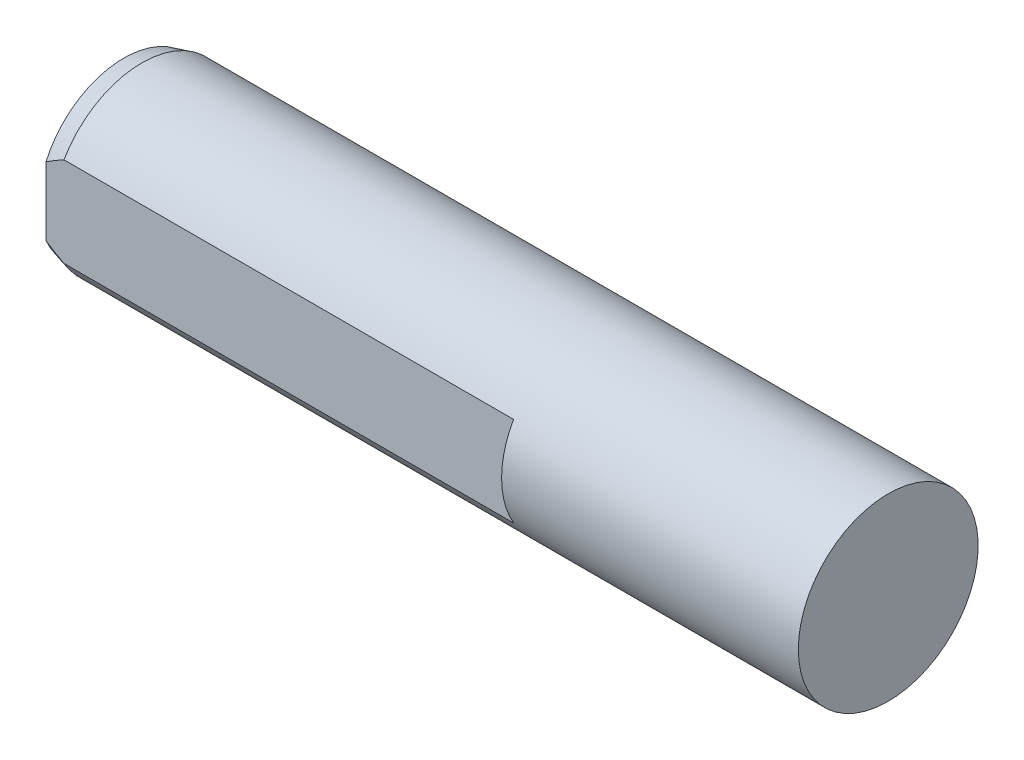
ISO-10303-21;
HEADER;
FILE_DESCRIPTION(('STEP AP214'),'2;1');
FILE_NAME('part.step','',(''),(''),'','','');
FILE_SCHEMA(('AUTOMOTIVE_DESIGN { 1 0 10303 214 1 1 1 1 }'));
ENDSEC;
DATA;
#1=APPLICATION_CONTEXT('core data for automotive mechanical design processes');
#2=APPLICATION_PROTOCOL_DEFINITION('international standard','automotive_design',2000,#1);
#3=PRODUCT_CONTEXT('',#1,'mechanical');
#4=PRODUCT('Part','Part','',(#3));
#5=PRODUCT_RELATED_PRODUCT_CATEGORY('part','',(#4));
#6=PRODUCT_DEFINITION_FORMATION('','',#4);
#7=PRODUCT_DEFINITION_CONTEXT('part definition',#1,'design');
#8=PRODUCT_DEFINITION('design','',#6,#7);
#9=PRODUCT_DEFINITION_SHAPE('','',#8);
#10=(LENGTH_UNIT() NAMED_UNIT(*) SI_UNIT(.MILLI.,.METRE.));
#11=(NAMED_UNIT(*) PLANE_ANGLE_UNIT() SI_UNIT($,.RADIAN.));
#12=(NAMED_UNIT(*) SI_UNIT($,.STERADIAN.) SOLID_ANGLE_UNIT());
#13=UNCERTAINTY_MEASURE_WITH_UNIT(LENGTH_MEASURE(1.E-05),#10,'distance_accuracy_value','');
#14=(GEOMETRIC_REPRESENTATION_CONTEXT(3) GLOBAL_UNCERTAINTY_ASSIGNED_CONTEXT((#13)) GLOBAL_UNIT_ASSIGNED_CONTEXT((#10,
#11,#12)) REPRESENTATION_CONTEXT('',''));
#15=CARTESIAN_POINT('',(0.,0.,0.));
#16=DIRECTION('',(0.,0.,1.));
#17=DIRECTION('',(1.,0.,0.));
#18=AXIS2_PLACEMENT_3D('',#15,#16,#17);
#19=CARTESIAN_POINT('',(-11.75,0.,0.));
#20=DIRECTION('',(-1.,0.,0.));
#21=DIRECTION('',(0.,0.,1.));
#22=AXIS2_PLACEMENT_3D('',#19,#20,#21);
#23=PLANE('',#22);
#24=DIRECTION('',(0.,1.,0.));
#25=VECTOR('',#24,1.);
#26=CARTESIAN_POINT('',(-11.75,0.,1.3));
#27=LINE('',#26,#25);
#28=CARTESIAN_POINT('',(-11.7500000000632,0.570357288169134,1.29999999999921));
#29=VERTEX_POINT('',#28);
#30=CARTESIAN_POINT('',(-11.7500000000316,-0.570357288188414,1.3));
#31=VERTEX_POINT('',#30);
#32=EDGE_CURVE('E64',#29,#31,#27,.F.);
#33=ORIENTED_EDGE('',*,*,#32,.F.);
#34=CARTESIAN_POINT('',(-11.7500000000632,0.,0.));
#35=DIRECTION('',(1.,0.,0.));
#36=DIRECTION('',(0.,0.,-1.));
#37=AXIS2_PLACEMENT_3D('',#34,#35,#36);
#38=CIRCLE('',#37,1.41961524229828);
#39=EDGE_CURVE('E20',#31,#29,#38,.T.);
#40=ORIENTED_EDGE('',*,*,#39,.F.);
#41=EDGE_LOOP('',(#33,#40));
#42=FACE_BOUND('',#41,.T.);
#43=ADVANCED_FACE('F17',(#42),#23,.T.);
#44=CARTESIAN_POINT('',(1.,0.,0.));
#45=DIRECTION('',(1.,0.,0.));
#46=DIRECTION('',(0.,0.,-1.));
#47=AXIS2_PLACEMENT_3D('',#44,#45,#46);
#48=PLANE('',#47);
#49=CARTESIAN_POINT('',(1.,0.,0.));
#50=DIRECTION('',(-1.,0.,0.));
#51=DIRECTION('',(0.,0.,1.));
#52=AXIS2_PLACEMENT_3D('',#49,#50,#51);
#53=CIRCLE('',#52,1.5);
#54=CARTESIAN_POINT('',(1.,0.,1.5));
#55=VERTEX_POINT('',#54);
#56=EDGE_CURVE('E106',#55,#55,#53,.T.);
#57=ORIENTED_EDGE('',*,*,#56,.F.);
#58=EDGE_LOOP('',(#57));
#59=FACE_BOUND('',#58,.T.);
#60=ADVANCED_FACE('F91',(#59),#48,.T.);
#61=CARTESIAN_POINT('',(-3.95,0.,1.4));
#62=DIRECTION('',(-1.,0.,0.));
#63=DIRECTION('',(0.,0.,1.));
#64=AXIS2_PLACEMENT_3D('',#61,#62,#63);
#65=PLANE('',#64);
#66=DIRECTION('',(0.,1.,0.));
#67=VECTOR('',#66,1.);
#68=CARTESIAN_POINT('',(-3.95,0.,1.3));
#69=LINE('',#68,#67);
#70=CARTESIAN_POINT('',(-3.95,-0.748331477354788,1.3));
#71=VERTEX_POINT('',#70);
#72=CARTESIAN_POINT('',(-3.95,0.748331477354789,1.3));
#73=VERTEX_POINT('',#72);
#74=EDGE_CURVE('E63',#71,#73,#69,.T.);
#75=ORIENTED_EDGE('',*,*,#74,.F.);
#76=CARTESIAN_POINT('',(-3.95,0.,0.));
#77=DIRECTION('',(-1.,0.,0.));
#78=DIRECTION('',(0.,0.,1.));
#79=AXIS2_PLACEMENT_3D('',#76,#77,#78);
#80=CIRCLE('',#79,1.5);
#81=EDGE_CURVE('E71',#73,#71,#80,.F.);
#82=ORIENTED_EDGE('',*,*,#81,.F.);
#83=EDGE_LOOP('',(#75,#82));
#84=FACE_BOUND('',#83,.T.);
#85=ADVANCED_FACE('F89',(#84),#65,.T.);
#86=CARTESIAN_POINT('',(-7.85,0.,1.3));
#87=DIRECTION('',(0.,0.,1.));
#88=DIRECTION('',(1.,0.,0.));
#89=AXIS2_PLACEMENT_3D('',#86,#87,#88);
#90=PLANE('',#89);
#91=DIRECTION('',(-1.,0.,0.));
#92=VECTOR('',#91,1.);
#93=CARTESIAN_POINT('',(-5.375,-0.748331477354789,1.3));
#94=LINE('',#93,#92);
#95=CARTESIAN_POINT('',(-11.449999999984,-0.74833147736012,1.30000000000926));
#96=VERTEX_POINT('',#95);
#97=EDGE_CURVE('E26',#71,#96,#94,.T.);
#98=ORIENTED_EDGE('',*,*,#97,.F.);
#99=ORIENTED_EDGE('',*,*,#74,.T.);
#100=DIRECTION('',(1.,0.,0.));
#101=VECTOR('',#100,1.);
#102=CARTESIAN_POINT('',(-7.85,0.748331477354789,1.3));
#103=LINE('',#102,#101);
#104=CARTESIAN_POINT('',(-11.449999999984,0.74833147736012,1.30000000000926));
#105=VERTEX_POINT('',#104);
#106=EDGE_CURVE('E56',#73,#105,#103,.F.);
#107=ORIENTED_EDGE('',*,*,#106,.T.);
#108=CARTESIAN_POINT('',(-11.7500000000632,0.570357288170932,1.29999999999842));
#109=CARTESIAN_POINT('',(-11.7388989444002,0.577760453697229,1.29999999100648));
#110=CARTESIAN_POINT('',(-11.7277427215158,0.585080483192389,1.29999992240212));
#111=CARTESIAN_POINT('',(-11.7050482896739,0.59974733404972,1.29999973747594));
#112=CARTESIAN_POINT('',(-11.693507526915,0.60709020565359,1.29999961999826));
#113=CARTESIAN_POINT('',(-11.6700441536913,0.621804809105704,1.29999941429875));
#114=CARTESIAN_POINT('',(-11.6581191672071,0.62917274797282,1.29999932687393));
#115=CARTESIAN_POINT('',(-11.6338870915622,0.643939183072896,1.29999921269528));
#116=CARTESIAN_POINT('',(-11.6215777818672,0.651334033210612,1.29999918747488));
#117=CARTESIAN_POINT('',(-11.5965769335581,0.666156018057409,1.29999920450629));
#118=CARTESIAN_POINT('',(-11.5838833214961,0.673579652901559,1.29999924839522));
#119=CARTESIAN_POINT('',(-11.558113705059,0.688460833274241,1.29999938495844));
#120=CARTESIAN_POINT('',(-11.5450357624759,0.695915020520075,1.29999947876316));
#121=CARTESIAN_POINT('',(-11.5184974065824,0.710858948931249,1.29999967657035));
#122=CARTESIAN_POINT('',(-11.5050351820795,0.71834547102474,1.2999997807595));
#123=CARTESIAN_POINT('',(-11.4777279369921,0.733355386280835,1.29999994259857));
#124=CARTESIAN_POINT('',(-11.4638812169596,0.74087568881687,1.29999999912658));
#125=CARTESIAN_POINT('',(-11.449999999968,0.748331477365451,1.30000000001852));
#126=B_SPLINE_CURVE_WITH_KNOTS('',3,(#108,#109,#110,#111,#112,#113,#114,#115,#116,#117,#118,
#119,#120,#121,#122,#123,#124,#125),.UNSPECIFIED.,.F.,.F.,(4,2,2,2,2,2,2,2,4),(0.,
0.0400288174334433,0.0810635960815221,0.123115125839812,0.166193366976947,0.210307521132346,
0.255466095813731,0.301676962959842,0.348947412102482),.UNSPECIFIED.);
#127=EDGE_CURVE('E58',#29,#105,#126,.T.);
#128=ORIENTED_EDGE('',*,*,#127,.F.);
#129=ORIENTED_EDGE('',*,*,#32,.T.);
#130=CARTESIAN_POINT('',(-11.449999999968,-0.748331477365451,1.30000000001852));
#131=CARTESIAN_POINT('',(-11.4638812169596,-0.740875688816869,1.29999999912658));
#132=CARTESIAN_POINT('',(-11.4777279369921,-0.733355386280835,1.29999994259857));
#133=CARTESIAN_POINT('',(-11.5050351820795,-0.71834547102474,1.2999997807595));
#134=CARTESIAN_POINT('',(-11.5184974065824,-0.710858948931249,1.29999967657035));
#135=CARTESIAN_POINT('',(-11.5450357624759,-0.695915020520074,1.29999947876316));
#136=CARTESIAN_POINT('',(-11.558113705059,-0.68846083327424,1.29999938495844));
#137=CARTESIAN_POINT('',(-11.5838833214961,-0.673579652901559,1.29999924839522));
#138=CARTESIAN_POINT('',(-11.5965769335581,-0.666156018057409,1.29999920450629));
#139=CARTESIAN_POINT('',(-11.6215777818672,-0.651334033210612,1.29999918747488));
#140=CARTESIAN_POINT('',(-11.6338870915622,-0.643939183072895,1.29999921269528));
#141=CARTESIAN_POINT('',(-11.6581191672071,-0.629172747972819,1.29999932687393));
#142=CARTESIAN_POINT('',(-11.6700441536913,-0.621804809105704,1.29999941429875));
#143=CARTESIAN_POINT('',(-11.693507526915,-0.60709020565359,1.29999961999826));
#144=CARTESIAN_POINT('',(-11.7050482896739,-0.59974733404972,1.29999973747594));
#145=CARTESIAN_POINT('',(-11.7277427215158,-0.585080483192387,1.29999992240212));
#146=CARTESIAN_POINT('',(-11.7388989444002,-0.577760453697227,1.29999999100648));
#147=CARTESIAN_POINT('',(-11.7500000000632,-0.570357288170932,1.29999999999842));
#148=B_SPLINE_CURVE_WITH_KNOTS('',3,(#130,#131,#132,#133,#134,#135,#136,#137,#138,#139,#140,
#141,#142,#143,#144,#145,#146,#147),.UNSPECIFIED.,.F.,.F.,(4,2,2,2,2,2,2,2,4),(0.,
0.0472704491426399,0.0934813162887527,0.138639890970136,0.182754045125537,0.22583228626267,
0.267883816020961,0.308918594669039,0.348947412102482),.UNSPECIFIED.);
#149=EDGE_CURVE('E35',#96,#31,#148,.T.);
#150=ORIENTED_EDGE('',*,*,#149,.F.);
#151=EDGE_LOOP('',(#98,#99,#107,#128,#129,#150));
#152=FACE_BOUND('',#151,.T.);
#153=ADVANCED_FACE('F62',(#152),#90,.T.);
#154=CARTESIAN_POINT('',(-11.449999999968,0.,0.));
#155=DIRECTION('',(1.,0.,0.));
#156=DIRECTION('',(0.,0.,-1.));
#157=AXIS2_PLACEMENT_3D('',#154,#155,#156);
#158=CONICAL_SURFACE('',#157,1.50000000002137,0.261799387700385);
#159=ORIENTED_EDGE('',*,*,#149,.T.);
#160=ORIENTED_EDGE('',*,*,#39,.T.);
#161=ORIENTED_EDGE('',*,*,#127,.T.);
#162=CARTESIAN_POINT('',(-11.45,0.,0.));
#163=DIRECTION('',(-1.,0.,0.));
#164=DIRECTION('',(0.,0.,1.));
#165=AXIS2_PLACEMENT_3D('',#162,#163,#164);
#166=CIRCLE('',#165,1.5);
#167=EDGE_CURVE('E11',#96,#105,#166,.F.);
#168=ORIENTED_EDGE('',*,*,#167,.F.);
#169=EDGE_LOOP('',(#159,#160,#161,#168));
#170=FACE_BOUND('',#169,.T.);
#171=ADVANCED_FACE('F59',(#170),#158,.T.);
#172=CARTESIAN_POINT('',(-5.375,0.,0.));
#173=DIRECTION('',(-1.,0.,0.));
#174=DIRECTION('',(0.,0.,1.));
#175=AXIS2_PLACEMENT_3D('',#172,#173,#174);
#176=CYLINDRICAL_SURFACE('',#175,1.5);
#177=ORIENTED_EDGE('',*,*,#56,.T.);
#178=EDGE_LOOP('',(#177));
#179=FACE_BOUND('',#178,.T.);
#180=ORIENTED_EDGE('',*,*,#97,.T.);
#181=ORIENTED_EDGE('',*,*,#167,.T.);
#182=ORIENTED_EDGE('',*,*,#106,.F.);
#183=ORIENTED_EDGE('',*,*,#81,.T.);
#184=EDGE_LOOP('',(#180,#181,#182,#183));
#185=FACE_BOUND('',#184,.T.);
#186=ADVANCED_FACE('F53',(#179,#185),#176,.T.);
#187=CLOSED_SHELL('',(#43,#60,#85,#153,#171,#186));
#188=MANIFOLD_SOLID_BREP('B1',#187);
#189=ADVANCED_BREP_SHAPE_REPRESENTATION('',(#18,#188),#14);
#190=SHAPE_DEFINITION_REPRESENTATION(#9,#189);
ENDSEC;
END-ISO-10303-21;
